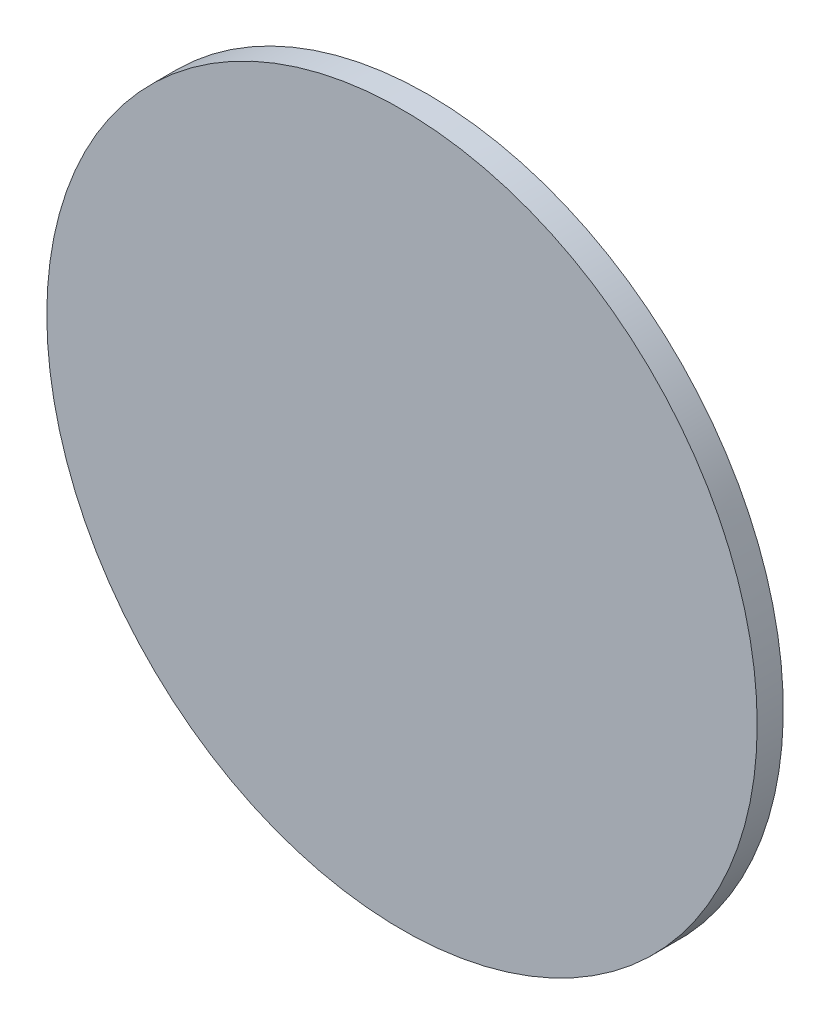
ISO-10303-21;
HEADER;
FILE_DESCRIPTION(('STEP AP214'),'2;1');
FILE_NAME('part.step','',(''),(''),'','','');
FILE_SCHEMA(('AUTOMOTIVE_DESIGN { 1 0 10303 214 1 1 1 1 }'));
ENDSEC;
DATA;
#1=APPLICATION_CONTEXT('core data for automotive mechanical design processes');
#2=APPLICATION_PROTOCOL_DEFINITION('international standard','automotive_design',2000,#1);
#3=PRODUCT_CONTEXT('',#1,'mechanical');
#4=PRODUCT('Part','Part','',(#3));
#5=PRODUCT_RELATED_PRODUCT_CATEGORY('part','',(#4));
#6=PRODUCT_DEFINITION_FORMATION('','',#4);
#7=PRODUCT_DEFINITION_CONTEXT('part definition',#1,'design');
#8=PRODUCT_DEFINITION('design','',#6,#7);
#9=PRODUCT_DEFINITION_SHAPE('','',#8);
#10=(LENGTH_UNIT() NAMED_UNIT(*) SI_UNIT(.MILLI.,.METRE.));
#11=(NAMED_UNIT(*) PLANE_ANGLE_UNIT() SI_UNIT($,.RADIAN.));
#12=(NAMED_UNIT(*) SI_UNIT($,.STERADIAN.) SOLID_ANGLE_UNIT());
#13=UNCERTAINTY_MEASURE_WITH_UNIT(LENGTH_MEASURE(1.E-05),#10,'distance_accuracy_value','');
#14=(GEOMETRIC_REPRESENTATION_CONTEXT(3) GLOBAL_UNCERTAINTY_ASSIGNED_CONTEXT((#13)) GLOBAL_UNIT_ASSIGNED_CONTEXT((#10,
#11,#12)) REPRESENTATION_CONTEXT('',''));
#15=CARTESIAN_POINT('',(0.,0.,0.));
#16=DIRECTION('',(0.,0.,1.));
#17=DIRECTION('',(1.,0.,0.));
#18=AXIS2_PLACEMENT_3D('',#15,#16,#17);
#19=CARTESIAN_POINT('',(0.,0.,0.));
#20=CARTESIAN_POINT('',(0.,0.0600000081376708,0.00119992695776459));
#21=CARTESIAN_POINT('',(0.,0.153333415148632,0.00306358100881744));
#22=CARTESIAN_POINT('',(0.,0.413333152831262,0.00827868050287163));
#23=CARTESIAN_POINT('',(0.,0.633331638365874,0.0126723912263249));
#24=CARTESIAN_POINT('',(0.,0.826667471988824,0.0165409672367332));
#25=CARTESIAN_POINT('',(0.,0.859999273337544,0.017206294177258));
#26=CARTESIAN_POINT('',(0.,0.880002710118304,0.0176097251981178));
#27=CARTESIAN_POINT('',(0.,0.899989886189244,0.0179968050302707));
#28=CARTESIAN_POINT('',(0.,0.920037751813017,0.0184450548303428));
#29=CARTESIAN_POINT('',(0.,0.939859146499568,0.0186649763551836));
#30=CARTESIAN_POINT('',(0.,0.960525621525506,0.0197430383066925));
#31=CARTESIAN_POINT('',(0.,0.978038360503737,0.0176108700583873));
#32=CARTESIAN_POINT('',(0.,1.00244148312185,0.0258200412137478));
#33=CARTESIAN_POINT('',(0.,0.999998682774994,0.0100236012266523));
#34=CARTESIAN_POINT('',(0.,0.997564468601526,-0.00594242672070706));
#35=CARTESIAN_POINT('',(0.,1.02196232272127,0.00328948291166937));
#36=CARTESIAN_POINT('',(0.,1.03947416233541,0.00184601679293918));
#37=CARTESIAN_POINT('',(0.,1.06014093263624,0.00375644875093766));
#38=CARTESIAN_POINT('',(0.,1.07996220818526,0.00477019550260096));
#39=CARTESIAN_POINT('',(0.,1.10001011508449,0.00602276233086229));
#40=CARTESIAN_POINT('',(0.,1.11999733141616,0.00721075510947434));
#41=CARTESIAN_POINT('',(0.,1.16000402664676,0.00962569368440373));
#42=CARTESIAN_POINT('',(0.,1.21333217781096,0.0128205306778512));
#43=CARTESIAN_POINT('',(0.,1.28666694996814,0.0172387512198494));
#44=CARTESIAN_POINT('',(0.,1.36000006346932,0.0216388540312405));
#45=CARTESIAN_POINT('',(0.,1.43333325044506,0.0260541394169754));
#46=CARTESIAN_POINT('',(0.,1.50666682505521,0.0304580803724952));
#47=CARTESIAN_POINT('',(0.,1.57999977086963,0.0348735845559978));
#48=CARTESIAN_POINT('',(0.,1.65333354722075,0.0392750853742149));
#49=CARTESIAN_POINT('',(0.,1.72666643695279,0.0436911687544934));
#50=CARTESIAN_POINT('',(0.,1.78666690479807,0.0472919849637029));
#51=CARTESIAN_POINT('',(0.,1.8333337997986,0.0500997047926458));
#52=CARTESIAN_POINT('',(0.,1.85999937480013,0.0517037410397502));
#53=CARTESIAN_POINT('',(0.,1.88000217744151,0.0529083141734299));
#54=CARTESIAN_POINT('',(0.,1.8999919154208,0.0540990022526662));
#55=CARTESIAN_POINT('',(0.,1.92003028075213,0.0553436840839126));
#56=CARTESIAN_POINT('',(0.,1.93988686198553,0.0563922556873));
#57=CARTESIAN_POINT('',(0.,1.96042237213188,0.0581653002101614));
#58=CARTESIAN_POINT('',(0.,1.97842353531855,0.0572425422709371));
#59=CARTESIAN_POINT('',(0.,2.00588525599228,0.0663731259001115));
#60=CARTESIAN_POINT('',(0.,1.99803990979115,0.0379805670136057));
#61=CARTESIAN_POINT('',(0.,2.00195459425457,0.0221827582091863));
#62=CARTESIAN_POINT('',(0.,1.99413381860143,-0.00650055387917294));
#63=CARTESIAN_POINT('',(0.,2.02157933307392,0.00375423996334038));
#64=CARTESIAN_POINT('',(0.,2.03957675978686,0.00355399391167977));
#65=CARTESIAN_POINT('',(0.,2.0601134679915,0.006155774431637));
#66=CARTESIAN_POINT('',(0.,2.07996953574141,0.00800892683477165));
#67=CARTESIAN_POINT('',(0.,2.10000822361373,0.0100605020377812));
#68=CARTESIAN_POINT('',(0.,2.12666092861415,0.012727943955492));
#69=CARTESIAN_POINT('',(0.,2.16666902733512,0.0167578912942277));
#70=CARTESIAN_POINT('',(0.,2.21999946379288,0.022111624433908));
#71=CARTESIAN_POINT('',(0.,2.27999992322241,0.0281500126186997));
#72=CARTESIAN_POINT('',(0.,2.34000025178145,0.0341750909304964));
#73=CARTESIAN_POINT('',(0.,2.3999996982202,0.0402128794857715));
#74=CARTESIAN_POINT('',(0.,2.46000031606509,0.0462381289659029));
#75=CARTESIAN_POINT('',(0.,2.51999967985538,0.0522758685997464));
#76=CARTESIAN_POINT('',(0.,2.58000032121381,0.0583011330543912));
#77=CARTESIAN_POINT('',(0.,2.64666626456333,0.065009668826151));
#78=CARTESIAN_POINT('',(0.,2.71333370746601,0.071703615516797));
#79=CARTESIAN_POINT('',(0.,2.77999967193997,0.0784117595073383));
#80=CARTESIAN_POINT('',(0.,2.82666748729645,0.0830988907246265));
#81=CARTESIAN_POINT('',(0.,2.85999934380289,0.0864508578044182));
#82=CARTESIAN_POINT('',(0.,2.8800022223813,0.0884628738758738));
#83=CARTESIAN_POINT('',(0.,2.89999193250672,0.0904636633317416));
#84=CARTESIAN_POINT('',(0.,2.92002988161158,0.0925144559967123));
#85=CARTESIAN_POINT('',(0.,2.93988870648447,0.0943705288817698));
#86=CARTESIAN_POINT('',(0.,2.96041512498753,0.0969614100362945));
#87=CARTESIAN_POINT('',(0.,2.97845095346913,0.0968018410548329));
#88=CARTESIAN_POINT('',(0.,3.00578275441966,0.106915880674954));
#89=CARTESIAN_POINT('',(0.,2.99842303373267,0.0786746160172491));
#90=CARTESIAN_POINT('',(0.,3.00052493184318,0.0609000402095454));
#91=CARTESIAN_POINT('',(0.,2.99947726522398,0.0396132511302729));
#92=CARTESIAN_POINT('',(0.,3.00156598989069,0.0219066023365613));
#93=CARTESIAN_POINT('',(0.,2.99424739308041,-0.00665407902806716));
#94=CARTESIAN_POINT('',(0.,3.02155287681134,0.00461530590162397));
#95=CARTESIAN_POINT('',(0.,3.03958382541697,0.00517844924179798));
#96=CARTESIAN_POINT('',(0.,3.06011159876087,0.00861287403658125));
#97=CARTESIAN_POINT('',(0.,3.07997001285699,0.0112800898620306));
#98=CARTESIAN_POINT('',(0.,3.10000811932261,0.0141507345221933));
#99=CARTESIAN_POINT('',(0.,3.12666097915352,0.0179084327209861));
#100=CARTESIAN_POINT('',(0.,3.16000098257644,0.0226298298892838));
#101=CARTESIAN_POINT('',(0.,3.20666651493846,0.0292245807726084));
#102=CARTESIAN_POINT('',(0.,3.26666637112785,0.0377163406016544));
#103=CARTESIAN_POINT('',(0.,3.33333378783882,0.0471369735491662));
#104=CARTESIAN_POINT('',(0.,3.39999958150565,0.0565717456323859));
#105=CARTESIAN_POINT('',(0.,3.46666714658721,0.065993555176786));
#106=CARTESIAN_POINT('',(0.,3.53333286418906,0.0754283301054299));
#107=CARTESIAN_POINT('',(0.,3.60666714032823,0.0857926459792984));
#108=CARTESIAN_POINT('',(0.,3.6733328651449,0.0952273119505051));
#109=CARTESIAN_POINT('',(0.,3.74666716515201,0.105591464772787));
#110=CARTESIAN_POINT('',(0.,3.80666620712211,0.11408140449154));
#111=CARTESIAN_POINT('',(0.,3.85333170325809,0.120679393019675));
#112=CARTESIAN_POINT('',(0.,3.88000225061079,0.124452988415074));
#113=CARTESIAN_POINT('',(0.,3.89999191161616,0.127271290373572));
#114=CARTESIAN_POINT('',(0.,3.92002987167863,0.130141817225369));
#115=CARTESIAN_POINT('',(0.,3.93988883216019,0.132809472719913));
#116=CARTESIAN_POINT('',(0.,3.96041451893968,0.136242248719079));
#117=CARTESIAN_POINT('',(0.,3.97845308633369,0.136811525786607));
#118=CARTESIAN_POINT('',(0.,4.0057752653797,0.148070470207106));
#119=CARTESIAN_POINT('',(0.,3.99845043142152,0.11943469625392));
#120=CARTESIAN_POINT('',(0.,4.00042253637747,0.101502897359467));
#121=CARTESIAN_POINT('',(0.,3.99985941377769,0.0806493702473773));
#122=CARTESIAN_POINT('',(0.,4.0001397875577,0.060775597697672));
#123=CARTESIAN_POINT('',(0.,3.99958145666885,0.0399042639435653));
#124=CARTESIAN_POINT('',(0.,4.00153439497877,0.0220436908826898));
#125=CARTESIAN_POINT('',(0.,3.99426548786826,-0.00692269709203168));
#126=CARTESIAN_POINT('',(0.,4.02155195128029,0.00552334054567585));
#127=CARTESIAN_POINT('',(0.,4.03958426127604,0.00682163795878719));
#128=CARTESIAN_POINT('',(0.,4.0601112881396,0.0111161488877176));
#129=CARTESIAN_POINT('',(0.,4.0799702881626,0.014605709052753));
#130=CARTESIAN_POINT('',(0.,4.10000785360132,0.018313068006351));
#131=CARTESIAN_POINT('',(0.,4.1199980020731,0.0219599646557968));
#132=CARTESIAN_POINT('',(0.,4.16000292337719,0.0292903008124085));
#133=CARTESIAN_POINT('',(0.,4.21333284046347,0.0390414392391568));
#134=CARTESIAN_POINT('',(0.,4.28666643736055,0.05247197203525));
#135=CARTESIAN_POINT('',(0.,4.35333360444236,0.0646678389355891));
#136=CARTESIAN_POINT('',(0.,4.42666615502461,0.0780950504005528));
#137=CARTESIAN_POINT('',(0.,4.4933336751086,0.0902920688996902));
#138=CARTESIAN_POINT('',(0.,4.55999951281803,0.102498344432364));
#139=CARTESIAN_POINT('',(0.,4.62666734594306,0.114693948452496));
#140=CARTESIAN_POINT('',(0.,4.69333267737732,0.126902919009913));
#141=CARTESIAN_POINT('',(0.,4.7600005533809,0.139098309380207));
#142=CARTESIAN_POINT('',(0.,4.82666604560578,0.151306393494697));
#143=CARTESIAN_POINT('',(0.,4.8933339345688,0.163501714963272));
#144=CARTESIAN_POINT('',(0.,4.95333295240583,0.174488747959151));
#145=CARTESIAN_POINT('',(0.,4.98666676889079,0.180587108141213));
#146=CARTESIAN_POINT('',(0.,5.,0.183028));
#147=B_SPLINE_CURVE_WITH_KNOTS('',3,(#19,#20,#21,#22,#23,#24,#25,#26,#27,#28,#29,#30,#31,#32,
#33,#34,#35,#36,#37,#38,#39,#40,#41,#42,#43,#44,#45,#46,#47,#48,#49,#50,#51,#52,#53,#54,#55,#56,
#57,#58,#59,#60,#61,#62,#63,#64,#65,#66,#67,#68,#69,#70,#71,#72,#73,#74,#75,#76,#77,#78,#79,#80,
#81,#82,#83,#84,#85,#86,#87,#88,#89,#90,#91,#92,#93,#94,#95,#96,#97,#98,#99,#100,#101,#102,#103,
#104,#105,#106,#107,#108,#109,#110,#111,#112,#113,#114,#115,#116,#117,#118,#119,#120,#121,#122,
#123,#124,#125,#126,#127,#128,#129,#130,#131,#132,#133,#134,#135,#136,#137,#138,#139,#140,#141,
#142,#143,#144,#145,#146),.UNSPECIFIED.,.F.,.F.,(4,1,1,1,1,1,1,1,1,1,1,1,1,1,1,1,1,1,1,1,1,1,1,
1,1,1,1,1,1,1,1,1,1,1,1,1,1,1,1,1,1,1,1,1,1,1,1,1,1,1,1,1,1,1,1,1,1,1,1,1,1,1,1,1,1,1,1,1,1,1,1,
1,1,1,1,1,1,1,1,1,1,1,1,1,1,1,1,1,1,1,1,1,1,1,1,1,1,1,1,1,1,1,1,1,1,1,1,1,1,1,1,1,1,1,1,1,1,1,1,
1,1,1,1,1,1,4),(0.,0.0336158912080154,0.0522913879850331,0.145668868131851,0.156874167693369,
0.160609266301119,0.164344364908868,0.168079463516618,0.171814562124367,0.175549664470387,
0.179284763078136,0.183019861685886,0.186754960293635,0.188622883070027,0.190490805846419,
0.194231895837415,0.197972997034569,0.201714087025564,0.205455188222718,0.209196278213714,
0.212937368204709,0.216678469401863,0.231642840572004,0.242866132957307,0.257830504127447,
0.272794886503746,0.284018167682891,0.29898255005919,0.31394692122933,0.325170213614633,
0.340134584784774,0.347616775972923,0.351357877170077,0.355098967161072,0.358840057152068,
0.362581158349222,0.366322248340217,0.370063349537371,0.373804439528367,0.377545529519362,
0.381287350035045,0.385029170550729,0.388770991066412,0.392524154440885,0.396277336491019,
0.400030499865492,0.403783681915626,0.407536845290099,0.411290027340233,0.41879637276484,
0.43005588156392,0.441315409038661,0.452574917837741,0.463834445312482,0.475093954111562,
0.486353481586303,0.497612990385383,0.508872517860124,0.523885190033677,0.535144717508418,
0.546404226307498,0.550157408357632,0.553910571732105,0.557663753782239,0.561416917156712,
0.565170099206846,0.568923262581319,0.572676444631453,0.576429608005926,0.580183565164998,
0.58393733560648,0.587691292765553,0.591445249924625,0.595199207083697,0.598970706373799,
0.602742231810254,0.606513731100355,0.61028525653681,0.614056755826912,0.617828281263366,
0.625371305989923,0.632914304570126,0.644228854733137,0.659314878039896,0.670629428202907,
0.681943952219565,0.697030001672678,0.708344525689336,0.723430575142448,0.734745099159107,
0.749831148612219,0.757374173338775,0.761145672628877,0.764917198065332,0.768688697355434,
0.772460222791888,0.77623172208199,0.780003221372092,0.783774746808546,0.787547002291498,
0.791319257774449,0.795091513257401,0.798863955457943,0.802636210940895,0.806408466423846,
0.810180721906798,0.813977122259523,0.817773488996654,0.82156988934938,0.825366256086511,
0.829162656439237,0.832959023176368,0.836755423529093,0.851940957708807,0.863330125151389,
0.878515659331103,0.889904826773685,0.905090360953399,0.916479528395981,0.927868662222969,
0.943054230018277,0.954443363845265,0.965832531287847,0.981018065467561,0.992407232910143,1.),.UNSPECIFIED.);
#148=CARTESIAN_POINT('',(0.,0.,0.));
#149=DIRECTION('',(0.,0.,-1.));
#150=AXIS1_PLACEMENT('',#148,#149);
#151=SURFACE_OF_REVOLUTION('',#147,#150);
#152=CARTESIAN_POINT('',(0.,0.,0.183028));
#153=DIRECTION('',(0.,0.,-1.));
#154=DIRECTION('',(-1.,0.,0.));
#155=AXIS2_PLACEMENT_3D('',#152,#153,#154);
#156=CIRCLE('',#155,5.);
#157=CARTESIAN_POINT('',(-5.,0.,0.183028));
#158=VERTEX_POINT('',#157);
#159=EDGE_CURVE('E48',#158,#158,#156,.T.);
#160=ORIENTED_EDGE('',*,*,#159,.T.);
#161=EDGE_LOOP('',(#160));
#162=FACE_BOUND('',#161,.T.);
#163=CARTESIAN_POINT('',(0.,0.,0.));
#164=VERTEX_POINT('',#163);
#165=VERTEX_LOOP('',#164);
#166=FACE_BOUND('',#165,.T.);
#167=ADVANCED_FACE('F41',(#162,#166),#151,.F.);
#168=CARTESIAN_POINT('',(0.,0.,0.550094867050117));
#169=DIRECTION('',(0.,0.,1.));
#170=DIRECTION('',(1.,0.,0.));
#171=AXIS2_PLACEMENT_3D('',#168,#169,#170);
#172=PLANE('',#171);
#173=CARTESIAN_POINT('',(0.,0.,0.550094867050117));
#174=DIRECTION('',(0.,0.,-1.));
#175=DIRECTION('',(-1.,0.,0.));
#176=AXIS2_PLACEMENT_3D('',#173,#174,#175);
#177=CIRCLE('',#176,5.);
#178=CARTESIAN_POINT('',(-5.,0.,0.550094867050117));
#179=VERTEX_POINT('',#178);
#180=EDGE_CURVE('E11',#179,#179,#177,.T.);
#181=ORIENTED_EDGE('',*,*,#180,.F.);
#182=EDGE_LOOP('',(#181));
#183=FACE_BOUND('',#182,.T.);
#184=ADVANCED_FACE('F52',(#183),#172,.T.);
#185=CARTESIAN_POINT('',(0.,0.,0.));
#186=DIRECTION('',(0.,0.,-1.));
#187=DIRECTION('',(-1.,0.,0.));
#188=AXIS2_PLACEMENT_3D('',#185,#186,#187);
#189=CYLINDRICAL_SURFACE('',#188,5.);
#190=ORIENTED_EDGE('',*,*,#180,.T.);
#191=EDGE_LOOP('',(#190));
#192=FACE_BOUND('',#191,.T.);
#193=ORIENTED_EDGE('',*,*,#159,.F.);
#194=EDGE_LOOP('',(#193));
#195=FACE_BOUND('',#194,.T.);
#196=ADVANCED_FACE('F57',(#192,#195),#189,.T.);
#197=CLOSED_SHELL('',(#167,#184,#196));
#198=MANIFOLD_SOLID_BREP('B2',#197);
#199=ADVANCED_BREP_SHAPE_REPRESENTATION('',(#18,#198),#14);
#200=SHAPE_DEFINITION_REPRESENTATION(#9,#199);
ENDSEC;
END-ISO-10303-21;
